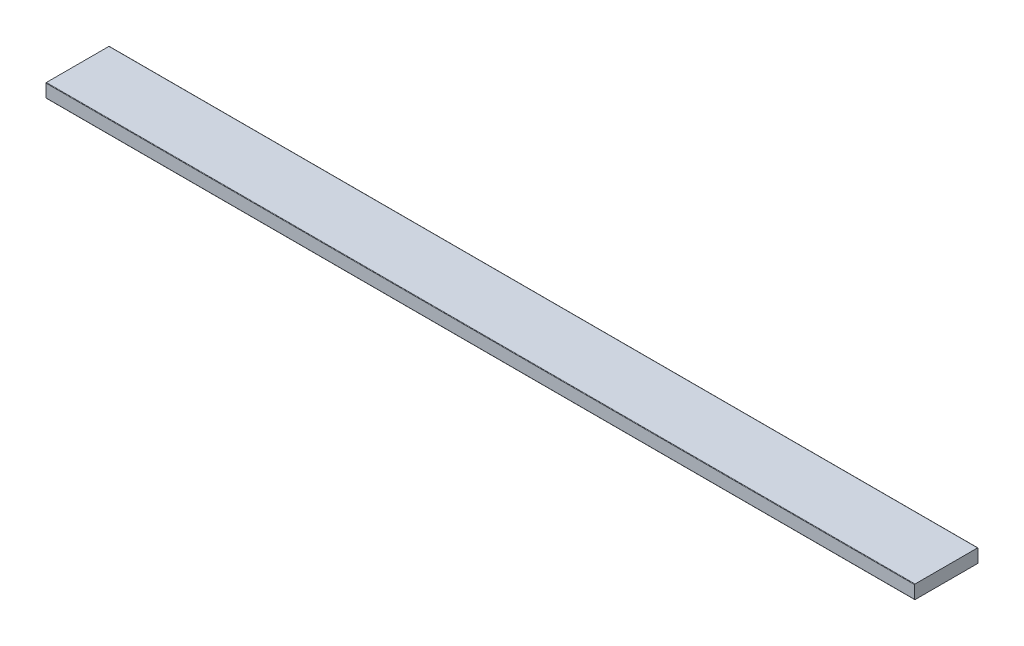
ISO-10303-21;
HEADER;
FILE_DESCRIPTION(('STEP AP214'),'2;1');
FILE_NAME('part.step','',(''),(''),'','','');
FILE_SCHEMA(('AUTOMOTIVE_DESIGN { 1 0 10303 214 1 1 1 1 }'));
ENDSEC;
DATA;
#1=APPLICATION_CONTEXT('core data for automotive mechanical design processes');
#2=APPLICATION_PROTOCOL_DEFINITION('international standard','automotive_design',2000,#1);
#3=PRODUCT_CONTEXT('',#1,'mechanical');
#4=PRODUCT('Part','Part','',(#3));
#5=PRODUCT_RELATED_PRODUCT_CATEGORY('part','',(#4));
#6=PRODUCT_DEFINITION_FORMATION('','',#4);
#7=PRODUCT_DEFINITION_CONTEXT('part definition',#1,'design');
#8=PRODUCT_DEFINITION('design','',#6,#7);
#9=PRODUCT_DEFINITION_SHAPE('','',#8);
#10=(LENGTH_UNIT() NAMED_UNIT(*) SI_UNIT(.MILLI.,.METRE.));
#11=(NAMED_UNIT(*) PLANE_ANGLE_UNIT() SI_UNIT($,.RADIAN.));
#12=(NAMED_UNIT(*) SI_UNIT($,.STERADIAN.) SOLID_ANGLE_UNIT());
#13=UNCERTAINTY_MEASURE_WITH_UNIT(LENGTH_MEASURE(1.E-05),#10,'distance_accuracy_value','');
#14=(GEOMETRIC_REPRESENTATION_CONTEXT(3) GLOBAL_UNCERTAINTY_ASSIGNED_CONTEXT((#13)) GLOBAL_UNIT_ASSIGNED_CONTEXT((#10,
#11,#12)) REPRESENTATION_CONTEXT('',''));
#15=CARTESIAN_POINT('',(0.,0.,0.));
#16=DIRECTION('',(0.,0.,1.));
#17=DIRECTION('',(1.,0.,0.));
#18=AXIS2_PLACEMENT_3D('',#15,#16,#17);
#19=CARTESIAN_POINT('',(-304.8,-4.76250000000001,-22.225));
#20=DIRECTION('',(-1.,0.,0.));
#21=DIRECTION('',(0.,0.,1.));
#22=AXIS2_PLACEMENT_3D('',#19,#20,#21);
#23=PLANE('',#22);
#24=DIRECTION('',(0.,0.,1.));
#25=VECTOR('',#24,1.);
#26=CARTESIAN_POINT('',(-304.8,-4.76250000000001,-22.225));
#27=LINE('',#26,#25);
#28=CARTESIAN_POINT('',(-304.8,-4.76250000000001,-21.910675));
#29=VERTEX_POINT('',#28);
#30=CARTESIAN_POINT('',(-304.8,-4.76250000000001,21.9106749999999));
#31=VERTEX_POINT('',#30);
#32=EDGE_CURVE('E191',#29,#31,#27,.T.);
#33=ORIENTED_EDGE('',*,*,#32,.T.);
#34=CARTESIAN_POINT('',(-304.8,-4.44817500000001,21.9106749999999));
#35=DIRECTION('',(-1.,0.,0.));
#36=DIRECTION('',(0.,0.,1.));
#37=AXIS2_PLACEMENT_3D('',#34,#35,#36);
#38=CIRCLE('',#37,0.314325);
#39=CARTESIAN_POINT('',(-304.8,-4.44817500000001,22.2249999999999));
#40=VERTEX_POINT('',#39);
#41=EDGE_CURVE('E169',#31,#40,#38,.T.);
#42=ORIENTED_EDGE('',*,*,#41,.T.);
#43=DIRECTION('',(0.,1.,0.));
#44=VECTOR('',#43,1.);
#45=CARTESIAN_POINT('',(-304.8,-4.76250000000001,22.2249999999999));
#46=LINE('',#45,#44);
#47=CARTESIAN_POINT('',(-304.8,4.44817499999999,22.2249999999999));
#48=VERTEX_POINT('',#47);
#49=EDGE_CURVE('E130',#40,#48,#46,.T.);
#50=ORIENTED_EDGE('',*,*,#49,.T.);
#51=CARTESIAN_POINT('',(-304.8,4.44817499999999,21.9106749999999));
#52=DIRECTION('',(-1.,0.,0.));
#53=DIRECTION('',(0.,0.,1.));
#54=AXIS2_PLACEMENT_3D('',#51,#52,#53);
#55=CIRCLE('',#54,0.314325);
#56=CARTESIAN_POINT('',(-304.8,4.76249999999999,21.9106749999999));
#57=VERTEX_POINT('',#56);
#58=EDGE_CURVE('E162',#48,#57,#55,.T.);
#59=ORIENTED_EDGE('',*,*,#58,.T.);
#60=DIRECTION('',(0.,0.,1.));
#61=VECTOR('',#60,1.);
#62=CARTESIAN_POINT('',(-304.8,4.76249999999999,-22.225));
#63=LINE('',#62,#61);
#64=CARTESIAN_POINT('',(-304.8,4.76249999999999,-21.910675));
#65=VERTEX_POINT('',#64);
#66=EDGE_CURVE('E186',#65,#57,#63,.T.);
#67=ORIENTED_EDGE('',*,*,#66,.F.);
#68=CARTESIAN_POINT('',(-304.8,4.44817499999999,-21.910675));
#69=DIRECTION('',(-1.,0.,0.));
#70=DIRECTION('',(0.,0.,1.));
#71=AXIS2_PLACEMENT_3D('',#68,#69,#70);
#72=CIRCLE('',#71,0.314325);
#73=CARTESIAN_POINT('',(-304.8,4.44817499999999,-22.225));
#74=VERTEX_POINT('',#73);
#75=EDGE_CURVE('E57',#65,#74,#72,.T.);
#76=ORIENTED_EDGE('',*,*,#75,.T.);
#77=DIRECTION('',(0.,1.,0.));
#78=VECTOR('',#77,1.);
#79=CARTESIAN_POINT('',(-304.8,-4.76250000000001,-22.225));
#80=LINE('',#79,#78);
#81=CARTESIAN_POINT('',(-304.8,-4.44817500000001,-22.225));
#82=VERTEX_POINT('',#81);
#83=EDGE_CURVE('E143',#82,#74,#80,.T.);
#84=ORIENTED_EDGE('',*,*,#83,.F.);
#85=CARTESIAN_POINT('',(-304.8,-4.44817500000001,-21.910675));
#86=DIRECTION('',(-1.,0.,0.));
#87=DIRECTION('',(0.,0.,1.));
#88=AXIS2_PLACEMENT_3D('',#85,#86,#87);
#89=CIRCLE('',#88,0.314325);
#90=EDGE_CURVE('E65',#82,#29,#89,.T.);
#91=ORIENTED_EDGE('',*,*,#90,.T.);
#92=EDGE_LOOP('',(#33,#42,#50,#59,#67,#76,#84,#91));
#93=FACE_BOUND('',#92,.T.);
#94=ADVANCED_FACE('F41',(#93),#23,.T.);
#95=CARTESIAN_POINT('',(-304.8,-4.76250000000001,-22.225));
#96=DIRECTION('',(0.,0.,-1.));
#97=DIRECTION('',(-1.,0.,0.));
#98=AXIS2_PLACEMENT_3D('',#95,#96,#97);
#99=PLANE('',#98);
#100=DIRECTION('',(0.,1.,0.));
#101=VECTOR('',#100,1.);
#102=CARTESIAN_POINT('',(304.8,-4.76250000000001,-22.225));
#103=LINE('',#102,#101);
#104=CARTESIAN_POINT('',(304.8,-4.44817500000001,-22.225));
#105=VERTEX_POINT('',#104);
#106=CARTESIAN_POINT('',(304.8,4.44817499999999,-22.225));
#107=VERTEX_POINT('',#106);
#108=EDGE_CURVE('E138',#105,#107,#103,.T.);
#109=ORIENTED_EDGE('',*,*,#108,.F.);
#110=DIRECTION('',(-1.,0.,0.));
#111=VECTOR('',#110,1.);
#112=CARTESIAN_POINT('',(-304.8,-4.44817500000001,-22.225));
#113=LINE('',#112,#111);
#114=EDGE_CURVE('E175',#105,#82,#113,.T.);
#115=ORIENTED_EDGE('',*,*,#114,.T.);
#116=ORIENTED_EDGE('',*,*,#83,.T.);
#117=DIRECTION('',(-1.,0.,0.));
#118=VECTOR('',#117,1.);
#119=CARTESIAN_POINT('',(-304.8,4.44817499999999,-22.225));
#120=LINE('',#119,#118);
#121=EDGE_CURVE('E172',#74,#107,#120,.F.);
#122=ORIENTED_EDGE('',*,*,#121,.T.);
#123=EDGE_LOOP('',(#109,#115,#116,#122));
#124=FACE_BOUND('',#123,.T.);
#125=ADVANCED_FACE('F204',(#124),#99,.T.);
#126=CARTESIAN_POINT('',(304.8,-4.76250000000001,-22.225));
#127=DIRECTION('',(1.,0.,0.));
#128=DIRECTION('',(0.,0.,-1.));
#129=AXIS2_PLACEMENT_3D('',#126,#127,#128);
#130=PLANE('',#129);
#131=DIRECTION('',(0.,1.,0.));
#132=VECTOR('',#131,1.);
#133=CARTESIAN_POINT('',(304.8,-4.76250000000001,22.2249999999999));
#134=LINE('',#133,#132);
#135=CARTESIAN_POINT('',(304.8,-4.44817500000001,22.2249999999999));
#136=VERTEX_POINT('',#135);
#137=CARTESIAN_POINT('',(304.8,4.44817499999999,22.2249999999999));
#138=VERTEX_POINT('',#137);
#139=EDGE_CURVE('E127',#136,#138,#134,.T.);
#140=ORIENTED_EDGE('',*,*,#139,.F.);
#141=CARTESIAN_POINT('',(304.8,-4.44817500000001,21.9106749999999));
#142=DIRECTION('',(1.,0.,0.));
#143=DIRECTION('',(0.,0.,-1.));
#144=AXIS2_PLACEMENT_3D('',#141,#142,#143);
#145=CIRCLE('',#144,0.314325);
#146=CARTESIAN_POINT('',(304.8,-4.76250000000001,21.9106749999999));
#147=VERTEX_POINT('',#146);
#148=EDGE_CURVE('E109',#136,#147,#145,.T.);
#149=ORIENTED_EDGE('',*,*,#148,.T.);
#150=DIRECTION('',(0.,0.,-1.));
#151=VECTOR('',#150,1.);
#152=CARTESIAN_POINT('',(304.8,-4.76250000000001,-22.225));
#153=LINE('',#152,#151);
#154=CARTESIAN_POINT('',(304.8,-4.76250000000001,-21.910675));
#155=VERTEX_POINT('',#154);
#156=EDGE_CURVE('E145',#147,#155,#153,.T.);
#157=ORIENTED_EDGE('',*,*,#156,.T.);
#158=CARTESIAN_POINT('',(304.8,-4.44817500000001,-21.910675));
#159=DIRECTION('',(1.,0.,0.));
#160=DIRECTION('',(0.,0.,-1.));
#161=AXIS2_PLACEMENT_3D('',#158,#159,#160);
#162=CIRCLE('',#161,0.314325);
#163=EDGE_CURVE('E121',#155,#105,#162,.T.);
#164=ORIENTED_EDGE('',*,*,#163,.T.);
#165=ORIENTED_EDGE('',*,*,#108,.T.);
#166=CARTESIAN_POINT('',(304.8,4.44817499999999,-21.910675));
#167=DIRECTION('',(1.,0.,0.));
#168=DIRECTION('',(0.,0.,-1.));
#169=AXIS2_PLACEMENT_3D('',#166,#167,#168);
#170=CIRCLE('',#169,0.314325);
#171=CARTESIAN_POINT('',(304.8,4.76249999999999,-21.910675));
#172=VERTEX_POINT('',#171);
#173=EDGE_CURVE('E153',#107,#172,#170,.T.);
#174=ORIENTED_EDGE('',*,*,#173,.T.);
#175=DIRECTION('',(0.,0.,-1.));
#176=VECTOR('',#175,1.);
#177=CARTESIAN_POINT('',(304.8,4.76249999999999,-22.225));
#178=LINE('',#177,#176);
#179=CARTESIAN_POINT('',(304.8,4.76249999999999,21.9106749999999));
#180=VERTEX_POINT('',#179);
#181=EDGE_CURVE('E184',#180,#172,#178,.T.);
#182=ORIENTED_EDGE('',*,*,#181,.F.);
#183=CARTESIAN_POINT('',(304.8,4.44817499999999,21.9106749999999));
#184=DIRECTION('',(1.,0.,0.));
#185=DIRECTION('',(0.,0.,-1.));
#186=AXIS2_PLACEMENT_3D('',#183,#184,#185);
#187=CIRCLE('',#186,0.314325);
#188=EDGE_CURVE('E132',#180,#138,#187,.T.);
#189=ORIENTED_EDGE('',*,*,#188,.T.);
#190=EDGE_LOOP('',(#140,#149,#157,#164,#165,#174,#182,#189));
#191=FACE_BOUND('',#190,.T.);
#192=ADVANCED_FACE('F135',(#191),#130,.T.);
#193=CARTESIAN_POINT('',(-304.8,-4.76250000000001,22.2249999999999));
#194=DIRECTION('',(0.,0.,1.));
#195=DIRECTION('',(1.,0.,0.));
#196=AXIS2_PLACEMENT_3D('',#193,#194,#195);
#197=PLANE('',#196);
#198=ORIENTED_EDGE('',*,*,#49,.F.);
#199=DIRECTION('',(1.,0.,0.));
#200=VECTOR('',#199,1.);
#201=CARTESIAN_POINT('',(304.8,-4.44817500000001,22.2249999999999));
#202=LINE('',#201,#200);
#203=EDGE_CURVE('E113',#40,#136,#202,.T.);
#204=ORIENTED_EDGE('',*,*,#203,.T.);
#205=ORIENTED_EDGE('',*,*,#139,.T.);
#206=DIRECTION('',(1.,0.,0.));
#207=VECTOR('',#206,1.);
#208=CARTESIAN_POINT('',(-304.8,4.44817499999999,22.2249999999999));
#209=LINE('',#208,#207);
#210=EDGE_CURVE('E133',#138,#48,#209,.F.);
#211=ORIENTED_EDGE('',*,*,#210,.T.);
#212=EDGE_LOOP('',(#198,#204,#205,#211));
#213=FACE_BOUND('',#212,.T.);
#214=ADVANCED_FACE('F126',(#213),#197,.T.);
#215=CARTESIAN_POINT('',(0.,-4.76250000000001,0.));
#216=DIRECTION('',(0.,1.,0.));
#217=DIRECTION('',(0.,0.,1.));
#218=AXIS2_PLACEMENT_3D('',#215,#216,#217);
#219=PLANE('',#218);
#220=ORIENTED_EDGE('',*,*,#156,.F.);
#221=DIRECTION('',(1.,0.,0.));
#222=VECTOR('',#221,1.);
#223=CARTESIAN_POINT('',(-304.8,-4.76250000000001,21.9106749999999));
#224=LINE('',#223,#222);
#225=EDGE_CURVE('E114',#147,#31,#224,.F.);
#226=ORIENTED_EDGE('',*,*,#225,.T.);
#227=ORIENTED_EDGE('',*,*,#32,.F.);
#228=DIRECTION('',(-1.,0.,0.));
#229=VECTOR('',#228,1.);
#230=CARTESIAN_POINT('',(304.8,-4.76250000000001,-21.910675));
#231=LINE('',#230,#229);
#232=EDGE_CURVE('E120',#29,#155,#231,.F.);
#233=ORIENTED_EDGE('',*,*,#232,.T.);
#234=EDGE_LOOP('',(#220,#226,#227,#233));
#235=FACE_BOUND('',#234,.T.);
#236=ADVANCED_FACE('F228',(#235),#219,.F.);
#237=CARTESIAN_POINT('',(0.,4.76249999999999,0.));
#238=DIRECTION('',(0.,1.,0.));
#239=DIRECTION('',(0.,0.,1.));
#240=AXIS2_PLACEMENT_3D('',#237,#238,#239);
#241=PLANE('',#240);
#242=ORIENTED_EDGE('',*,*,#181,.T.);
#243=DIRECTION('',(-1.,0.,0.));
#244=VECTOR('',#243,1.);
#245=CARTESIAN_POINT('',(0.,4.76249999999999,-21.910675));
#246=LINE('',#245,#244);
#247=EDGE_CURVE('E11',#172,#65,#246,.T.);
#248=ORIENTED_EDGE('',*,*,#247,.T.);
#249=ORIENTED_EDGE('',*,*,#66,.T.);
#250=DIRECTION('',(1.,0.,0.));
#251=VECTOR('',#250,1.);
#252=CARTESIAN_POINT('',(0.,4.76249999999999,21.9106749999999));
#253=LINE('',#252,#251);
#254=EDGE_CURVE('E50',#57,#180,#253,.T.);
#255=ORIENTED_EDGE('',*,*,#254,.T.);
#256=EDGE_LOOP('',(#242,#248,#249,#255));
#257=FACE_BOUND('',#256,.T.);
#258=ADVANCED_FACE('F183',(#257),#241,.T.);
#259=CARTESIAN_POINT('',(-304.8,-4.44817500000001,21.9106749999999));
#260=DIRECTION('',(-1.,0.,0.));
#261=DIRECTION('',(0.,0.,1.));
#262=AXIS2_PLACEMENT_3D('',#259,#260,#261);
#263=CYLINDRICAL_SURFACE('',#262,0.314325);
#264=ORIENTED_EDGE('',*,*,#41,.F.);
#265=ORIENTED_EDGE('',*,*,#225,.F.);
#266=ORIENTED_EDGE('',*,*,#148,.F.);
#267=ORIENTED_EDGE('',*,*,#203,.F.);
#268=EDGE_LOOP('',(#264,#265,#266,#267));
#269=FACE_BOUND('',#268,.T.);
#270=ADVANCED_FACE('F112',(#269),#263,.T.);
#271=CARTESIAN_POINT('',(-304.8,-4.44817500000001,-21.910675));
#272=DIRECTION('',(1.,0.,0.));
#273=DIRECTION('',(0.,0.,-1.));
#274=AXIS2_PLACEMENT_3D('',#271,#272,#273);
#275=CYLINDRICAL_SURFACE('',#274,0.314325);
#276=ORIENTED_EDGE('',*,*,#163,.F.);
#277=ORIENTED_EDGE('',*,*,#232,.F.);
#278=ORIENTED_EDGE('',*,*,#90,.F.);
#279=ORIENTED_EDGE('',*,*,#114,.F.);
#280=EDGE_LOOP('',(#276,#277,#278,#279));
#281=FACE_BOUND('',#280,.T.);
#282=ADVANCED_FACE('F211',(#281),#275,.T.);
#283=CARTESIAN_POINT('',(0.,4.44817499999999,-21.910675));
#284=DIRECTION('',(-1.,0.,0.));
#285=DIRECTION('',(0.,0.,1.));
#286=AXIS2_PLACEMENT_3D('',#283,#284,#285);
#287=CYLINDRICAL_SURFACE('',#286,0.314325);
#288=ORIENTED_EDGE('',*,*,#173,.F.);
#289=ORIENTED_EDGE('',*,*,#121,.F.);
#290=ORIENTED_EDGE('',*,*,#75,.F.);
#291=ORIENTED_EDGE('',*,*,#247,.F.);
#292=EDGE_LOOP('',(#288,#289,#290,#291));
#293=FACE_BOUND('',#292,.T.);
#294=ADVANCED_FACE('F206',(#293),#287,.T.);
#295=CARTESIAN_POINT('',(0.,4.44817499999999,21.9106749999999));
#296=DIRECTION('',(1.,0.,0.));
#297=DIRECTION('',(0.,0.,-1.));
#298=AXIS2_PLACEMENT_3D('',#295,#296,#297);
#299=CYLINDRICAL_SURFACE('',#298,0.314325);
#300=ORIENTED_EDGE('',*,*,#58,.F.);
#301=ORIENTED_EDGE('',*,*,#210,.F.);
#302=ORIENTED_EDGE('',*,*,#188,.F.);
#303=ORIENTED_EDGE('',*,*,#254,.F.);
#304=EDGE_LOOP('',(#300,#301,#302,#303));
#305=FACE_BOUND('',#304,.T.);
#306=ADVANCED_FACE('F43',(#305),#299,.T.);
#307=CLOSED_SHELL('',(#94,#125,#192,#214,#236,#258,#270,#282,#294,#306));
#308=MANIFOLD_SOLID_BREP('B2',#307);
#309=ADVANCED_BREP_SHAPE_REPRESENTATION('',(#18,#308),#14);
#310=SHAPE_DEFINITION_REPRESENTATION(#9,#309);
ENDSEC;
END-ISO-10303-21;
